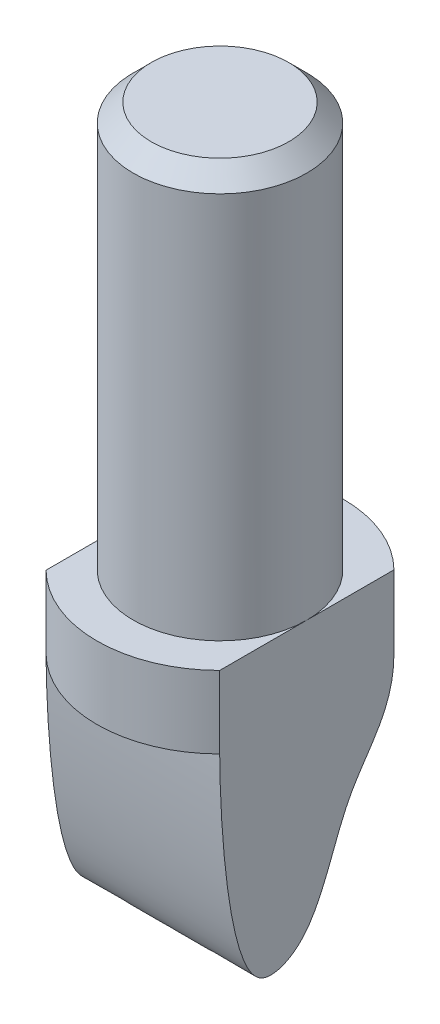
ISO-10303-21;
HEADER;
FILE_DESCRIPTION(('STEP AP214'),'2;1');
FILE_NAME('part.step','',(''),(''),'','','');
FILE_SCHEMA(('AUTOMOTIVE_DESIGN { 1 0 10303 214 1 1 1 1 }'));
ENDSEC;
DATA;
#1=APPLICATION_CONTEXT('core data for automotive mechanical design processes');
#2=APPLICATION_PROTOCOL_DEFINITION('international standard','automotive_design',2000,#1);
#3=PRODUCT_CONTEXT('',#1,'mechanical');
#4=PRODUCT('Part','Part','',(#3));
#5=PRODUCT_RELATED_PRODUCT_CATEGORY('part','',(#4));
#6=PRODUCT_DEFINITION_FORMATION('','',#4);
#7=PRODUCT_DEFINITION_CONTEXT('part definition',#1,'design');
#8=PRODUCT_DEFINITION('design','',#6,#7);
#9=PRODUCT_DEFINITION_SHAPE('','',#8);
#10=(LENGTH_UNIT() NAMED_UNIT(*) SI_UNIT(.MILLI.,.METRE.));
#11=(NAMED_UNIT(*) PLANE_ANGLE_UNIT() SI_UNIT($,.RADIAN.));
#12=(NAMED_UNIT(*) SI_UNIT($,.STERADIAN.) SOLID_ANGLE_UNIT());
#13=UNCERTAINTY_MEASURE_WITH_UNIT(LENGTH_MEASURE(1.E-05),#10,'distance_accuracy_value','');
#14=(GEOMETRIC_REPRESENTATION_CONTEXT(3) GLOBAL_UNCERTAINTY_ASSIGNED_CONTEXT((#13)) GLOBAL_UNIT_ASSIGNED_CONTEXT((#10,
#11,#12)) REPRESENTATION_CONTEXT('',''));
#15=CARTESIAN_POINT('',(0.,0.,0.));
#16=DIRECTION('',(0.,0.,1.));
#17=DIRECTION('',(1.,0.,0.));
#18=AXIS2_PLACEMENT_3D('',#15,#16,#17);
#19=CARTESIAN_POINT('',(0.,0.,0.));
#20=DIRECTION('',(0.,1.,0.));
#21=DIRECTION('',(0.,0.,1.));
#22=AXIS2_PLACEMENT_3D('',#19,#20,#21);
#23=PLANE('',#22);
#24=CARTESIAN_POINT('',(0.,0.,0.));
#25=DIRECTION('',(0.,1.,0.));
#26=DIRECTION('',(0.,0.,1.));
#27=AXIS2_PLACEMENT_3D('',#24,#25,#26);
#28=CIRCLE('',#27,1.7);
#29=CARTESIAN_POINT('',(1.2,0.,-1.20415945787923));
#30=VERTEX_POINT('',#29);
#31=CARTESIAN_POINT('',(-1.2,0.,-1.20415945787923));
#32=VERTEX_POINT('',#31);
#33=EDGE_CURVE('E81',#30,#32,#28,.T.);
#34=ORIENTED_EDGE('',*,*,#33,.F.);
#35=DIRECTION('',(-1.,0.,0.));
#36=VECTOR('',#35,1.);
#37=CARTESIAN_POINT('',(5.04726659994779,0.,-1.20415945787923));
#38=LINE('',#37,#36);
#39=EDGE_CURVE('E105',#30,#32,#38,.T.);
#40=ORIENTED_EDGE('',*,*,#39,.T.);
#41=EDGE_LOOP('',(#34,#40));
#42=FACE_BOUND('',#41,.T.);
#43=ADVANCED_FACE('F35',(#42),#23,.F.);
#44=CARTESIAN_POINT('',(0.,6.6,0.));
#45=DIRECTION('',(0.,-1.,0.));
#46=DIRECTION('',(0.,0.,-1.));
#47=AXIS2_PLACEMENT_3D('',#44,#45,#46);
#48=CYLINDRICAL_SURFACE('',#47,1.2);
#49=CARTESIAN_POINT('',(0.,1.,0.));
#50=DIRECTION('',(0.,1.,0.));
#51=DIRECTION('',(0.,0.,1.));
#52=AXIS2_PLACEMENT_3D('',#49,#50,#51);
#53=CIRCLE('',#52,1.2);
#54=CARTESIAN_POINT('',(-1.2,1.,0.));
#55=VERTEX_POINT('',#54);
#56=CARTESIAN_POINT('',(1.2,1.,0.));
#57=VERTEX_POINT('',#56);
#58=EDGE_CURVE('E39',#55,#57,#53,.T.);
#59=ORIENTED_EDGE('',*,*,#58,.T.);
#60=EDGE_CURVE('E11',#57,#55,#53,.T.);
#61=ORIENTED_EDGE('',*,*,#60,.T.);
#62=EDGE_LOOP('',(#59,#61));
#63=FACE_BOUND('',#62,.T.);
#64=CARTESIAN_POINT('',(0.,6.35,0.));
#65=DIRECTION('',(0.,1.,0.));
#66=DIRECTION('',(0.,0.,1.));
#67=AXIS2_PLACEMENT_3D('',#64,#65,#66);
#68=CIRCLE('',#67,1.2);
#69=CARTESIAN_POINT('',(0.,6.35,1.2));
#70=VERTEX_POINT('',#69);
#71=EDGE_CURVE('E165',#70,#70,#68,.F.);
#72=ORIENTED_EDGE('',*,*,#71,.T.);
#73=EDGE_LOOP('',(#72));
#74=FACE_BOUND('',#73,.T.);
#75=ADVANCED_FACE('F153',(#63,#74),#48,.T.);
#76=CARTESIAN_POINT('',(0.,6.6,0.));
#77=DIRECTION('',(0.,1.,0.));
#78=DIRECTION('',(0.,0.,1.));
#79=AXIS2_PLACEMENT_3D('',#76,#77,#78);
#80=PLANE('',#79);
#81=CARTESIAN_POINT('',(0.,6.6,0.));
#82=DIRECTION('',(0.,1.,0.));
#83=DIRECTION('',(0.,0.,1.));
#84=AXIS2_PLACEMENT_3D('',#81,#82,#83);
#85=CIRCLE('',#84,0.949999999999999);
#86=CARTESIAN_POINT('',(0.,6.6,0.949999999999999));
#87=VERTEX_POINT('',#86);
#88=EDGE_CURVE('E167',#87,#87,#85,.T.);
#89=ORIENTED_EDGE('',*,*,#88,.T.);
#90=EDGE_LOOP('',(#89));
#91=FACE_BOUND('',#90,.T.);
#92=ADVANCED_FACE('F150',(#91),#80,.T.);
#93=CARTESIAN_POINT('',(0.,6.6,0.));
#94=DIRECTION('',(0.,-1.,0.));
#95=DIRECTION('',(0.,0.,-1.));
#96=AXIS2_PLACEMENT_3D('',#93,#94,#95);
#97=CONICAL_SURFACE('',#96,0.949999999999999,0.785398163397447);
#98=ORIENTED_EDGE('',*,*,#71,.F.);
#99=EDGE_LOOP('',(#98));
#100=FACE_BOUND('',#99,.T.);
#101=ORIENTED_EDGE('',*,*,#88,.F.);
#102=EDGE_LOOP('',(#101));
#103=FACE_BOUND('',#102,.T.);
#104=ADVANCED_FACE('F37',(#100,#103),#97,.T.);
#105=CARTESIAN_POINT('',(0.,1.,0.));
#106=DIRECTION('',(0.,1.,0.));
#107=DIRECTION('',(0.,0.,1.));
#108=AXIS2_PLACEMENT_3D('',#105,#106,#107);
#109=PLANE('',#108);
#110=ORIENTED_EDGE('',*,*,#60,.F.);
#111=DIRECTION('',(0.,0.,-1.));
#112=VECTOR('',#111,1.);
#113=CARTESIAN_POINT('',(1.2,1.,0.));
#114=LINE('',#113,#112);
#115=CARTESIAN_POINT('',(1.2,1.,-1.20415945787923));
#116=VERTEX_POINT('',#115);
#117=EDGE_CURVE('E181',#57,#116,#114,.T.);
#118=ORIENTED_EDGE('',*,*,#117,.T.);
#119=CARTESIAN_POINT('',(0.,1.,0.));
#120=DIRECTION('',(0.,1.,0.));
#121=DIRECTION('',(0.,0.,1.));
#122=AXIS2_PLACEMENT_3D('',#119,#120,#121);
#123=CIRCLE('',#122,1.7);
#124=CARTESIAN_POINT('',(-1.2,1.,-1.20415945787923));
#125=VERTEX_POINT('',#124);
#126=EDGE_CURVE('E179',#116,#125,#123,.T.);
#127=ORIENTED_EDGE('',*,*,#126,.T.);
#128=DIRECTION('',(0.,0.,-1.));
#129=VECTOR('',#128,1.);
#130=CARTESIAN_POINT('',(-1.2,1.,0.));
#131=LINE('',#130,#129);
#132=EDGE_CURVE('E100',#55,#125,#131,.T.);
#133=ORIENTED_EDGE('',*,*,#132,.F.);
#134=EDGE_LOOP('',(#110,#118,#127,#133));
#135=FACE_BOUND('',#134,.T.);
#136=ADVANCED_FACE('F140',(#135),#109,.T.);
#137=CARTESIAN_POINT('',(1.2,1.,0.));
#138=DIRECTION('',(-1.,0.,0.));
#139=DIRECTION('',(0.,0.,1.));
#140=AXIS2_PLACEMENT_3D('',#137,#138,#139);
#141=PLANE('',#140);
#142=ORIENTED_EDGE('',*,*,#117,.F.);
#143=CARTESIAN_POINT('',(1.2,1.,1.20415945787923));
#144=VERTEX_POINT('',#143);
#145=EDGE_CURVE('E50',#144,#57,#114,.T.);
#146=ORIENTED_EDGE('',*,*,#145,.F.);
#147=DIRECTION('',(0.,-1.,0.));
#148=VECTOR('',#147,1.);
#149=CARTESIAN_POINT('',(1.2,1.,1.20415945787923));
#150=LINE('',#149,#148);
#151=CARTESIAN_POINT('',(1.2,0.,1.20415945787923));
#152=VERTEX_POINT('',#151);
#153=EDGE_CURVE('E173',#144,#152,#150,.T.);
#154=ORIENTED_EDGE('',*,*,#153,.T.);
#155=CARTESIAN_POINT('',(1.2,0.,-1.20415945787923));
#156=CARTESIAN_POINT('',(1.2,-0.666666666666667,-1.20415945787923));
#157=CARTESIAN_POINT('',(1.2,-1.28977535872261,-0.40249330661314));
#158=CARTESIAN_POINT('',(1.2,-2.93084984008456,-0.16072324508846));
#159=CARTESIAN_POINT('',(1.2,-3.09327163032067,1.10489929683316));
#160=CARTESIAN_POINT('',(1.2,-0.599999999999979,1.20415945787923));
#161=CARTESIAN_POINT('',(1.2,0.,1.20415945787923));
#162=B_SPLINE_CURVE_WITH_KNOTS('',3,(#155,#156,#157,#158,#159,#160,#161),.UNSPECIFIED.,.F.,.F.,
(4,1,1,1,4),(0.,0.278964607723073,0.615716947764863,0.687820486992556,1.),.UNSPECIFIED.);
#163=EDGE_CURVE('E92',#152,#30,#162,.F.);
#164=ORIENTED_EDGE('',*,*,#163,.T.);
#165=DIRECTION('',(0.,-1.,0.));
#166=VECTOR('',#165,1.);
#167=CARTESIAN_POINT('',(1.2,1.,-1.20415945787923));
#168=LINE('',#167,#166);
#169=EDGE_CURVE('E87',#116,#30,#168,.T.);
#170=ORIENTED_EDGE('',*,*,#169,.F.);
#171=EDGE_LOOP('',(#142,#146,#154,#164,#170));
#172=FACE_BOUND('',#171,.T.);
#173=ADVANCED_FACE('F146',(#172),#141,.F.);
#174=CARTESIAN_POINT('',(-1.2,1.,0.));
#175=DIRECTION('',(-1.,0.,0.));
#176=DIRECTION('',(0.,0.,1.));
#177=AXIS2_PLACEMENT_3D('',#174,#175,#176);
#178=PLANE('',#177);
#179=DIRECTION('',(0.,-1.,0.));
#180=VECTOR('',#179,1.);
#181=CARTESIAN_POINT('',(-1.2,1.,-1.20415945787923));
#182=LINE('',#181,#180);
#183=EDGE_CURVE('E85',#125,#32,#182,.T.);
#184=ORIENTED_EDGE('',*,*,#183,.T.);
#185=CARTESIAN_POINT('',(-1.2,0.,-1.20415945787923));
#186=CARTESIAN_POINT('',(-1.2,-0.666666666666667,-1.20415945787923));
#187=CARTESIAN_POINT('',(-1.2,-1.28977535872261,-0.40249330661314));
#188=CARTESIAN_POINT('',(-1.2,-2.93084984008456,-0.16072324508846));
#189=CARTESIAN_POINT('',(-1.2,-3.09327163032067,1.10489929683316));
#190=CARTESIAN_POINT('',(-1.2,-0.599999999999979,1.20415945787923));
#191=CARTESIAN_POINT('',(-1.2,0.,1.20415945787923));
#192=B_SPLINE_CURVE_WITH_KNOTS('',3,(#185,#186,#187,#188,#189,#190,#191),.UNSPECIFIED.,.F.,.F.,
(4,1,1,1,4),(0.,0.278964607723073,0.615716947764863,0.687820486992556,1.),.UNSPECIFIED.);
#193=CARTESIAN_POINT('',(-1.2,0.,1.20415945787923));
#194=VERTEX_POINT('',#193);
#195=EDGE_CURVE('E98',#32,#194,#192,.T.);
#196=ORIENTED_EDGE('',*,*,#195,.T.);
#197=DIRECTION('',(0.,-1.,0.));
#198=VECTOR('',#197,1.);
#199=CARTESIAN_POINT('',(-1.2,1.,1.20415945787923));
#200=LINE('',#199,#198);
#201=CARTESIAN_POINT('',(-1.2,1.,1.20415945787923));
#202=VERTEX_POINT('',#201);
#203=EDGE_CURVE('E102',#202,#194,#200,.T.);
#204=ORIENTED_EDGE('',*,*,#203,.F.);
#205=EDGE_CURVE('E177',#202,#55,#131,.T.);
#206=ORIENTED_EDGE('',*,*,#205,.T.);
#207=ORIENTED_EDGE('',*,*,#132,.T.);
#208=EDGE_LOOP('',(#184,#196,#204,#206,#207));
#209=FACE_BOUND('',#208,.T.);
#210=ADVANCED_FACE('F96',(#209),#178,.T.);
#211=CARTESIAN_POINT('',(0.,1.,0.));
#212=DIRECTION('',(0.,-1.,0.));
#213=DIRECTION('',(0.,0.,-1.));
#214=AXIS2_PLACEMENT_3D('',#211,#212,#213);
#215=CYLINDRICAL_SURFACE('',#214,1.7);
#216=ORIENTED_EDGE('',*,*,#33,.T.);
#217=ORIENTED_EDGE('',*,*,#183,.F.);
#218=ORIENTED_EDGE('',*,*,#126,.F.);
#219=ORIENTED_EDGE('',*,*,#169,.T.);
#220=EDGE_LOOP('',(#216,#217,#218,#219));
#221=FACE_BOUND('',#220,.T.);
#222=ADVANCED_FACE('F83',(#221),#215,.T.);
#223=EDGE_CURVE('E91',#194,#152,#28,.T.);
#224=ORIENTED_EDGE('',*,*,#223,.T.);
#225=ORIENTED_EDGE('',*,*,#153,.F.);
#226=EDGE_CURVE('E175',#202,#144,#123,.T.);
#227=ORIENTED_EDGE('',*,*,#226,.F.);
#228=ORIENTED_EDGE('',*,*,#203,.T.);
#229=EDGE_LOOP('',(#224,#225,#227,#228));
#230=FACE_BOUND('',#229,.T.);
#231=ADVANCED_FACE('F139',(#230),#215,.T.);
#232=ORIENTED_EDGE('',*,*,#58,.F.);
#233=ORIENTED_EDGE('',*,*,#205,.F.);
#234=ORIENTED_EDGE('',*,*,#226,.T.);
#235=ORIENTED_EDGE('',*,*,#145,.T.);
#236=EDGE_LOOP('',(#232,#233,#234,#235));
#237=FACE_BOUND('',#236,.T.);
#238=ADVANCED_FACE('F136',(#237),#109,.T.);
#239=ORIENTED_EDGE('',*,*,#223,.F.);
#240=DIRECTION('',(-1.,0.,0.));
#241=VECTOR('',#240,1.);
#242=CARTESIAN_POINT('',(5.04726659994779,0.,1.20415945787923));
#243=LINE('',#242,#241);
#244=EDGE_CURVE('E108',#152,#194,#243,.T.);
#245=ORIENTED_EDGE('',*,*,#244,.F.);
#246=EDGE_LOOP('',(#239,#245));
#247=FACE_BOUND('',#246,.T.);
#248=ADVANCED_FACE('F135',(#247),#23,.F.);
#249=CARTESIAN_POINT('',(5.04726659994779,0.,-1.20415945787923));
#250=CARTESIAN_POINT('',(5.04726659994779,-0.666666666666667,-1.20415945787923));
#251=CARTESIAN_POINT('',(5.04726659994779,-1.28977535872261,-0.40249330661314));
#252=CARTESIAN_POINT('',(5.04726659994779,-2.93084984008456,-0.16072324508846));
#253=CARTESIAN_POINT('',(5.04726659994779,-3.09327163032067,1.10489929683316));
#254=CARTESIAN_POINT('',(5.04726659994779,-0.599999999999979,1.20415945787923));
#255=CARTESIAN_POINT('',(5.04726659994779,0.,1.20415945787923));
#256=B_SPLINE_CURVE_WITH_KNOTS('',3,(#249,#250,#251,#252,#253,#254,#255),.UNSPECIFIED.,.F.,.F.,
(4,1,1,1,4),(0.,0.278964607723073,0.615716947764863,0.687820486992556,1.),.UNSPECIFIED.);
#257=DIRECTION('',(-1.,0.,0.));
#258=VECTOR('',#257,1.);
#259=SURFACE_OF_LINEAR_EXTRUSION('',#256,#258);
#260=ORIENTED_EDGE('',*,*,#163,.F.);
#261=ORIENTED_EDGE('',*,*,#244,.T.);
#262=ORIENTED_EDGE('',*,*,#195,.F.);
#263=ORIENTED_EDGE('',*,*,#39,.F.);
#264=EDGE_LOOP('',(#260,#261,#262,#263));
#265=FACE_BOUND('',#264,.T.);
#266=ADVANCED_FACE('F111',(#265),#259,.T.);
#267=CLOSED_SHELL('',(#43,#75,#92,#104,#136,#173,#210,#222,#231,#238,#248,#266));
#268=MANIFOLD_SOLID_BREP('B2',#267);
#269=ADVANCED_BREP_SHAPE_REPRESENTATION('',(#18,#268),#14);
#270=SHAPE_DEFINITION_REPRESENTATION(#9,#269);
ENDSEC;
END-ISO-10303-21;
